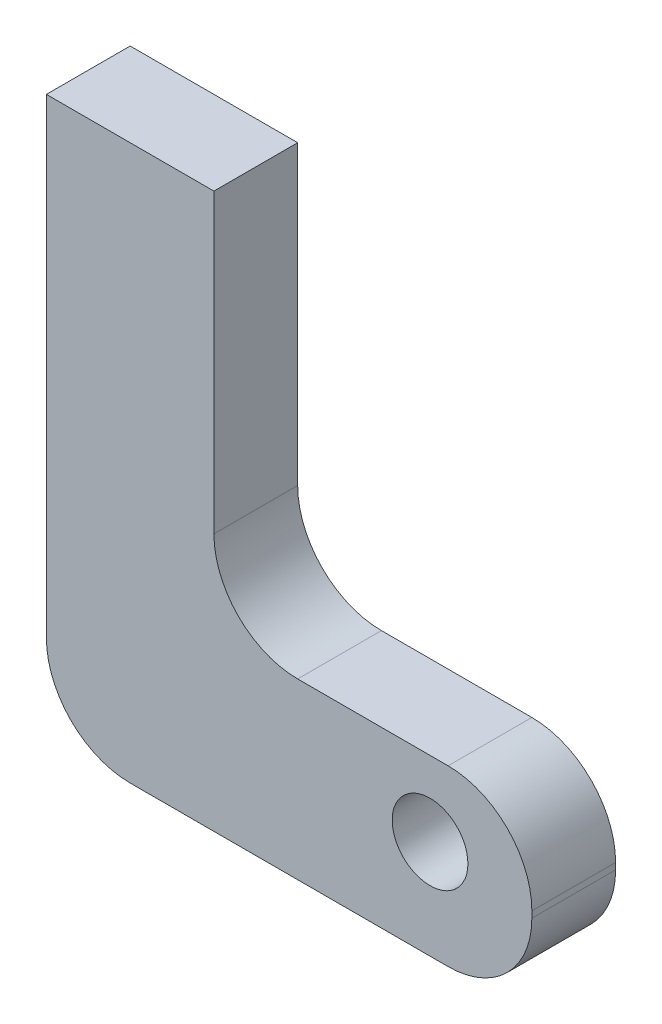
ISO-10303-21;
HEADER;
FILE_DESCRIPTION(('STEP AP214'),'2;1');
FILE_NAME('part.step','',(''),(''),'','','');
FILE_SCHEMA(('AUTOMOTIVE_DESIGN { 1 0 10303 214 1 1 1 1 }'));
ENDSEC;
DATA;
#1=APPLICATION_CONTEXT('core data for automotive mechanical design processes');
#2=APPLICATION_PROTOCOL_DEFINITION('international standard','automotive_design',2000,#1);
#3=PRODUCT_CONTEXT('',#1,'mechanical');
#4=PRODUCT('Part','Part','',(#3));
#5=PRODUCT_RELATED_PRODUCT_CATEGORY('part','',(#4));
#6=PRODUCT_DEFINITION_FORMATION('','',#4);
#7=PRODUCT_DEFINITION_CONTEXT('part definition',#1,'design');
#8=PRODUCT_DEFINITION('design','',#6,#7);
#9=PRODUCT_DEFINITION_SHAPE('','',#8);
#10=(LENGTH_UNIT() NAMED_UNIT(*) SI_UNIT(.MILLI.,.METRE.));
#11=(NAMED_UNIT(*) PLANE_ANGLE_UNIT() SI_UNIT($,.RADIAN.));
#12=(NAMED_UNIT(*) SI_UNIT($,.STERADIAN.) SOLID_ANGLE_UNIT());
#13=UNCERTAINTY_MEASURE_WITH_UNIT(LENGTH_MEASURE(1.E-05),#10,'distance_accuracy_value','');
#14=(GEOMETRIC_REPRESENTATION_CONTEXT(3) GLOBAL_UNCERTAINTY_ASSIGNED_CONTEXT((#13)) GLOBAL_UNIT_ASSIGNED_CONTEXT((#10,
#11,#12)) REPRESENTATION_CONTEXT('',''));
#15=CARTESIAN_POINT('',(0.,0.,0.));
#16=DIRECTION('',(0.,0.,1.));
#17=DIRECTION('',(1.,0.,0.));
#18=AXIS2_PLACEMENT_3D('',#15,#16,#17);
#19=CARTESIAN_POINT('',(0.,0.,6.35));
#20=DIRECTION('',(0.,0.,1.));
#21=DIRECTION('',(1.,0.,0.));
#22=AXIS2_PLACEMENT_3D('',#19,#20,#21);
#23=PLANE('',#22);
#24=DIRECTION('',(0.,-1.,0.));
#25=VECTOR('',#24,1.);
#26=CARTESIAN_POINT('',(113.949884677061,0.,6.35));
#27=LINE('',#26,#25);
#28=CARTESIAN_POINT('',(113.949884677061,0.,6.35));
#29=VERTEX_POINT('',#28);
#30=CARTESIAN_POINT('',(113.949884677061,-35.6901798780592,6.35));
#31=VERTEX_POINT('',#30);
#32=EDGE_CURVE('E151',#29,#31,#27,.T.);
#33=ORIENTED_EDGE('',*,*,#32,.T.);
#34=CARTESIAN_POINT('',(120.299884677061,-35.6901798780592,6.35));
#35=DIRECTION('',(0.,0.,1.));
#36=DIRECTION('',(1.,0.,0.));
#37=AXIS2_PLACEMENT_3D('',#34,#35,#36);
#38=CIRCLE('',#37,6.35);
#39=CARTESIAN_POINT('',(120.299884677061,-42.0401798780592,6.35));
#40=VERTEX_POINT('',#39);
#41=EDGE_CURVE('E169',#31,#40,#38,.T.);
#42=ORIENTED_EDGE('',*,*,#41,.T.);
#43=DIRECTION('',(1.,0.,0.));
#44=VECTOR('',#43,1.);
#45=CARTESIAN_POINT('',(113.949884677061,-42.0401798780592,6.35));
#46=LINE('',#45,#44);
#47=CARTESIAN_POINT('',(144.403776804995,-42.0401798780592,6.35));
#48=VERTEX_POINT('',#47);
#49=EDGE_CURVE('E240',#40,#48,#46,.T.);
#50=ORIENTED_EDGE('',*,*,#49,.T.);
#51=CARTESIAN_POINT('',(144.403776804995,-35.6901798780592,6.35));
#52=DIRECTION('',(0.,0.,1.));
#53=DIRECTION('',(1.,0.,0.));
#54=AXIS2_PLACEMENT_3D('',#51,#52,#53);
#55=CIRCLE('',#54,6.35);
#56=CARTESIAN_POINT('',(150.753776804995,-35.6901798780592,6.35));
#57=VERTEX_POINT('',#56);
#58=EDGE_CURVE('E167',#48,#57,#55,.T.);
#59=ORIENTED_EDGE('',*,*,#58,.T.);
#60=DIRECTION('',(0.,1.,0.));
#61=VECTOR('',#60,1.);
#62=CARTESIAN_POINT('',(150.753776804995,-42.0401798780592,6.35));
#63=LINE('',#62,#61);
#64=CARTESIAN_POINT('',(150.753776804995,-35.205984936289,6.35));
#65=VERTEX_POINT('',#64);
#66=EDGE_CURVE('E237',#57,#65,#63,.T.);
#67=ORIENTED_EDGE('',*,*,#66,.T.);
#68=CARTESIAN_POINT('',(144.403776804995,-35.205984936289,6.35));
#69=DIRECTION('',(0.,0.,1.));
#70=DIRECTION('',(1.,0.,0.));
#71=AXIS2_PLACEMENT_3D('',#68,#69,#70);
#72=CIRCLE('',#71,6.35);
#73=CARTESIAN_POINT('',(144.403776804995,-28.855984936289,6.35));
#74=VERTEX_POINT('',#73);
#75=EDGE_CURVE('E165',#65,#74,#72,.T.);
#76=ORIENTED_EDGE('',*,*,#75,.T.);
#77=DIRECTION('',(-1.,0.,0.));
#78=VECTOR('',#77,1.);
#79=CARTESIAN_POINT('',(126.649884677061,-28.855984936289,6.35));
#80=LINE('',#79,#78);
#81=CARTESIAN_POINT('',(132.999884677061,-28.855984936289,6.35));
#82=VERTEX_POINT('',#81);
#83=EDGE_CURVE('E117',#74,#82,#80,.T.);
#84=ORIENTED_EDGE('',*,*,#83,.T.);
#85=CARTESIAN_POINT('',(132.999884677061,-22.505984936289,6.35));
#86=DIRECTION('',(0.,0.,1.));
#87=DIRECTION('',(1.,0.,0.));
#88=AXIS2_PLACEMENT_3D('',#85,#86,#87);
#89=CIRCLE('',#88,6.35);
#90=CARTESIAN_POINT('',(126.649884677061,-22.505984936289,6.35));
#91=VERTEX_POINT('',#90);
#92=EDGE_CURVE('E11',#82,#91,#89,.F.);
#93=ORIENTED_EDGE('',*,*,#92,.T.);
#94=DIRECTION('',(0.,1.,0.));
#95=VECTOR('',#94,1.);
#96=CARTESIAN_POINT('',(126.649884677061,-6.34999999999994,6.35));
#97=LINE('',#96,#95);
#98=CARTESIAN_POINT('',(126.649884677061,0.,6.35));
#99=VERTEX_POINT('',#98);
#100=EDGE_CURVE('E107',#91,#99,#97,.T.);
#101=ORIENTED_EDGE('',*,*,#100,.T.);
#102=DIRECTION('',(-1.,0.,0.));
#103=VECTOR('',#102,1.);
#104=CARTESIAN_POINT('',(113.949884677061,0.,6.35));
#105=LINE('',#104,#103);
#106=EDGE_CURVE('E112',#99,#29,#105,.T.);
#107=ORIENTED_EDGE('',*,*,#106,.T.);
#108=EDGE_LOOP('',(#33,#42,#50,#59,#67,#76,#84,#93,#101,#107));
#109=FACE_BOUND('',#108,.T.);
#110=CARTESIAN_POINT('',(143.03564126646,-34.5396847170861,6.35));
#111=DIRECTION('',(0.,0.,1.));
#112=DIRECTION('',(1.,0.,0.));
#113=AXIS2_PLACEMENT_3D('',#110,#111,#112);
#114=CIRCLE('',#113,2.87019999999999);
#115=CARTESIAN_POINT('',(145.90584126646,-34.5396847170861,6.35));
#116=VERTEX_POINT('',#115);
#117=EDGE_CURVE('E141',#116,#116,#114,.T.);
#118=ORIENTED_EDGE('',*,*,#117,.F.);
#119=EDGE_LOOP('',(#118));
#120=FACE_BOUND('',#119,.T.);
#121=ADVANCED_FACE('F33',(#109,#120),#23,.T.);
#122=CARTESIAN_POINT('',(0.,0.,0.));
#123=DIRECTION('',(0.,0.,1.));
#124=DIRECTION('',(1.,0.,0.));
#125=AXIS2_PLACEMENT_3D('',#122,#123,#124);
#126=PLANE('',#125);
#127=DIRECTION('',(1.,0.,0.));
#128=VECTOR('',#127,1.);
#129=CARTESIAN_POINT('',(126.649884677061,-42.0401798780592,0.));
#130=LINE('',#129,#128);
#131=CARTESIAN_POINT('',(120.299884677061,-42.0401798780592,0.));
#132=VERTEX_POINT('',#131);
#133=CARTESIAN_POINT('',(144.403776804995,-42.0401798780592,0.));
#134=VERTEX_POINT('',#133);
#135=EDGE_CURVE('E140',#132,#134,#130,.T.);
#136=ORIENTED_EDGE('',*,*,#135,.F.);
#137=CARTESIAN_POINT('',(120.299884677061,-35.6901798780592,0.));
#138=DIRECTION('',(0.,0.,1.));
#139=DIRECTION('',(1.,0.,0.));
#140=AXIS2_PLACEMENT_3D('',#137,#138,#139);
#141=CIRCLE('',#140,6.35);
#142=CARTESIAN_POINT('',(113.949884677061,-35.6901798780592,0.));
#143=VERTEX_POINT('',#142);
#144=EDGE_CURVE('E161',#132,#143,#141,.F.);
#145=ORIENTED_EDGE('',*,*,#144,.T.);
#146=DIRECTION('',(0.,-1.,0.));
#147=VECTOR('',#146,1.);
#148=CARTESIAN_POINT('',(113.949884677061,-6.34999999999994,0.));
#149=LINE('',#148,#147);
#150=CARTESIAN_POINT('',(113.949884677061,0.,0.));
#151=VERTEX_POINT('',#150);
#152=EDGE_CURVE('E137',#151,#143,#149,.T.);
#153=ORIENTED_EDGE('',*,*,#152,.F.);
#154=DIRECTION('',(-1.,0.,0.));
#155=VECTOR('',#154,1.);
#156=CARTESIAN_POINT('',(113.949884677061,0.,0.));
#157=LINE('',#156,#155);
#158=CARTESIAN_POINT('',(126.649884677061,0.,0.));
#159=VERTEX_POINT('',#158);
#160=EDGE_CURVE('E150',#159,#151,#157,.T.);
#161=ORIENTED_EDGE('',*,*,#160,.F.);
#162=DIRECTION('',(0.,1.,0.));
#163=VECTOR('',#162,1.);
#164=CARTESIAN_POINT('',(126.649884677061,0.,0.));
#165=LINE('',#164,#163);
#166=CARTESIAN_POINT('',(126.649884677061,-22.505984936289,0.));
#167=VERTEX_POINT('',#166);
#168=EDGE_CURVE('E123',#167,#159,#165,.T.);
#169=ORIENTED_EDGE('',*,*,#168,.F.);
#170=CARTESIAN_POINT('',(132.999884677061,-22.505984936289,0.));
#171=DIRECTION('',(0.,0.,1.));
#172=DIRECTION('',(1.,0.,0.));
#173=AXIS2_PLACEMENT_3D('',#170,#171,#172);
#174=CIRCLE('',#173,6.35);
#175=CARTESIAN_POINT('',(132.999884677061,-28.855984936289,0.));
#176=VERTEX_POINT('',#175);
#177=EDGE_CURVE('E41',#167,#176,#174,.T.);
#178=ORIENTED_EDGE('',*,*,#177,.T.);
#179=DIRECTION('',(-1.,0.,0.));
#180=VECTOR('',#179,1.);
#181=CARTESIAN_POINT('',(126.649884677061,-28.855984936289,0.));
#182=LINE('',#181,#180);
#183=CARTESIAN_POINT('',(144.403776804995,-28.855984936289,0.));
#184=VERTEX_POINT('',#183);
#185=EDGE_CURVE('E147',#184,#176,#182,.T.);
#186=ORIENTED_EDGE('',*,*,#185,.F.);
#187=CARTESIAN_POINT('',(144.403776804995,-35.205984936289,0.));
#188=DIRECTION('',(0.,0.,1.));
#189=DIRECTION('',(1.,0.,0.));
#190=AXIS2_PLACEMENT_3D('',#187,#188,#189);
#191=CIRCLE('',#190,6.35);
#192=CARTESIAN_POINT('',(150.753776804995,-35.205984936289,0.));
#193=VERTEX_POINT('',#192);
#194=EDGE_CURVE('E157',#184,#193,#191,.F.);
#195=ORIENTED_EDGE('',*,*,#194,.T.);
#196=DIRECTION('',(0.,1.,0.));
#197=VECTOR('',#196,1.);
#198=CARTESIAN_POINT('',(150.753776804995,-42.0401798780592,0.));
#199=LINE('',#198,#197);
#200=CARTESIAN_POINT('',(150.753776804995,-35.6901798780592,0.));
#201=VERTEX_POINT('',#200);
#202=EDGE_CURVE('E144',#201,#193,#199,.T.);
#203=ORIENTED_EDGE('',*,*,#202,.F.);
#204=CARTESIAN_POINT('',(144.403776804995,-35.6901798780592,0.));
#205=DIRECTION('',(0.,0.,1.));
#206=DIRECTION('',(1.,0.,0.));
#207=AXIS2_PLACEMENT_3D('',#204,#205,#206);
#208=CIRCLE('',#207,6.35);
#209=EDGE_CURVE('E159',#201,#134,#208,.F.);
#210=ORIENTED_EDGE('',*,*,#209,.T.);
#211=EDGE_LOOP('',(#136,#145,#153,#161,#169,#178,#186,#195,#203,#210));
#212=FACE_BOUND('',#211,.T.);
#213=CARTESIAN_POINT('',(143.03564126646,-34.5396847170861,0.));
#214=DIRECTION('',(0.,0.,1.));
#215=DIRECTION('',(1.,0.,0.));
#216=AXIS2_PLACEMENT_3D('',#213,#214,#215);
#217=CIRCLE('',#216,2.87019999999999);
#218=CARTESIAN_POINT('',(145.90584126646,-34.5396847170861,0.));
#219=VERTEX_POINT('',#218);
#220=EDGE_CURVE('E247',#219,#219,#217,.T.);
#221=ORIENTED_EDGE('',*,*,#220,.T.);
#222=EDGE_LOOP('',(#221));
#223=FACE_BOUND('',#222,.T.);
#224=ADVANCED_FACE('F184',(#212,#223),#126,.F.);
#225=CARTESIAN_POINT('',(113.949884677061,-6.34999999999994,6.35));
#226=DIRECTION('',(1.,0.,0.));
#227=DIRECTION('',(0.,0.,-1.));
#228=AXIS2_PLACEMENT_3D('',#225,#226,#227);
#229=PLANE('',#228);
#230=ORIENTED_EDGE('',*,*,#152,.T.);
#231=DIRECTION('',(0.,0.,-1.));
#232=VECTOR('',#231,1.);
#233=CARTESIAN_POINT('',(113.949884677061,-35.6901798780592,6.35));
#234=LINE('',#233,#232);
#235=EDGE_CURVE('E163',#143,#31,#234,.F.);
#236=ORIENTED_EDGE('',*,*,#235,.T.);
#237=ORIENTED_EDGE('',*,*,#32,.F.);
#238=DIRECTION('',(0.,0.,-1.));
#239=VECTOR('',#238,1.);
#240=CARTESIAN_POINT('',(113.949884677061,0.,6.35));
#241=LINE('',#240,#239);
#242=EDGE_CURVE('E128',#29,#151,#241,.T.);
#243=ORIENTED_EDGE('',*,*,#242,.T.);
#244=EDGE_LOOP('',(#230,#236,#237,#243));
#245=FACE_BOUND('',#244,.T.);
#246=ADVANCED_FACE('F201',(#245),#229,.F.);
#247=CARTESIAN_POINT('',(126.649884677061,-42.0401798780592,6.35));
#248=DIRECTION('',(0.,1.,0.));
#249=DIRECTION('',(0.,0.,1.));
#250=AXIS2_PLACEMENT_3D('',#247,#248,#249);
#251=PLANE('',#250);
#252=ORIENTED_EDGE('',*,*,#49,.F.);
#253=DIRECTION('',(0.,0.,-1.));
#254=VECTOR('',#253,1.);
#255=CARTESIAN_POINT('',(120.299884677061,-42.0401798780592,6.35));
#256=LINE('',#255,#254);
#257=EDGE_CURVE('E154',#40,#132,#256,.T.);
#258=ORIENTED_EDGE('',*,*,#257,.T.);
#259=ORIENTED_EDGE('',*,*,#135,.T.);
#260=DIRECTION('',(0.,0.,-1.));
#261=VECTOR('',#260,1.);
#262=CARTESIAN_POINT('',(144.403776804995,-42.0401798780592,6.35));
#263=LINE('',#262,#261);
#264=EDGE_CURVE('E127',#134,#48,#263,.F.);
#265=ORIENTED_EDGE('',*,*,#264,.T.);
#266=EDGE_LOOP('',(#252,#258,#259,#265));
#267=FACE_BOUND('',#266,.T.);
#268=ADVANCED_FACE('F215',(#267),#251,.F.);
#269=CARTESIAN_POINT('',(150.753776804995,-42.0401798780592,6.35));
#270=DIRECTION('',(-1.,0.,0.));
#271=DIRECTION('',(0.,0.,1.));
#272=AXIS2_PLACEMENT_3D('',#269,#270,#271);
#273=PLANE('',#272);
#274=ORIENTED_EDGE('',*,*,#66,.F.);
#275=DIRECTION('',(0.,0.,-1.));
#276=VECTOR('',#275,1.);
#277=CARTESIAN_POINT('',(150.753776804995,-35.6901798780592,6.35));
#278=LINE('',#277,#276);
#279=EDGE_CURVE('E173',#57,#201,#278,.T.);
#280=ORIENTED_EDGE('',*,*,#279,.T.);
#281=ORIENTED_EDGE('',*,*,#202,.T.);
#282=DIRECTION('',(0.,0.,-1.));
#283=VECTOR('',#282,1.);
#284=CARTESIAN_POINT('',(150.753776804995,-35.205984936289,6.35));
#285=LINE('',#284,#283);
#286=EDGE_CURVE('E171',#193,#65,#285,.F.);
#287=ORIENTED_EDGE('',*,*,#286,.T.);
#288=EDGE_LOOP('',(#274,#280,#281,#287));
#289=FACE_BOUND('',#288,.T.);
#290=ADVANCED_FACE('F212',(#289),#273,.F.);
#291=CARTESIAN_POINT('',(126.649884677061,-28.855984936289,6.35));
#292=DIRECTION('',(0.,-1.,0.));
#293=DIRECTION('',(0.,0.,-1.));
#294=AXIS2_PLACEMENT_3D('',#291,#292,#293);
#295=PLANE('',#294);
#296=ORIENTED_EDGE('',*,*,#83,.F.);
#297=DIRECTION('',(0.,0.,-1.));
#298=VECTOR('',#297,1.);
#299=CARTESIAN_POINT('',(144.403776804995,-28.855984936289,6.35));
#300=LINE('',#299,#298);
#301=EDGE_CURVE('E177',#74,#184,#300,.T.);
#302=ORIENTED_EDGE('',*,*,#301,.T.);
#303=ORIENTED_EDGE('',*,*,#185,.T.);
#304=DIRECTION('',(0.,0.,-1.));
#305=VECTOR('',#304,1.);
#306=CARTESIAN_POINT('',(132.999884677061,-28.855984936289,6.35));
#307=LINE('',#306,#305);
#308=EDGE_CURVE('E54',#176,#82,#307,.F.);
#309=ORIENTED_EDGE('',*,*,#308,.T.);
#310=EDGE_LOOP('',(#296,#302,#303,#309));
#311=FACE_BOUND('',#310,.T.);
#312=ADVANCED_FACE('F187',(#311),#295,.F.);
#313=CARTESIAN_POINT('',(126.649884677061,0.,6.35));
#314=DIRECTION('',(-1.,0.,0.));
#315=DIRECTION('',(0.,0.,1.));
#316=AXIS2_PLACEMENT_3D('',#313,#314,#315);
#317=PLANE('',#316);
#318=ORIENTED_EDGE('',*,*,#100,.F.);
#319=DIRECTION('',(0.,0.,-1.));
#320=VECTOR('',#319,1.);
#321=CARTESIAN_POINT('',(126.649884677061,-22.505984936289,0.));
#322=LINE('',#321,#320);
#323=EDGE_CURVE('E180',#91,#167,#322,.T.);
#324=ORIENTED_EDGE('',*,*,#323,.T.);
#325=ORIENTED_EDGE('',*,*,#168,.T.);
#326=DIRECTION('',(0.,0.,-1.));
#327=VECTOR('',#326,1.);
#328=CARTESIAN_POINT('',(126.649884677061,0.,6.35));
#329=LINE('',#328,#327);
#330=EDGE_CURVE('E120',#99,#159,#329,.T.);
#331=ORIENTED_EDGE('',*,*,#330,.F.);
#332=EDGE_LOOP('',(#318,#324,#325,#331));
#333=FACE_BOUND('',#332,.T.);
#334=ADVANCED_FACE('F121',(#333),#317,.F.);
#335=CARTESIAN_POINT('',(113.949884677061,0.,6.35));
#336=DIRECTION('',(0.,-1.,0.));
#337=DIRECTION('',(0.,0.,-1.));
#338=AXIS2_PLACEMENT_3D('',#335,#336,#337);
#339=PLANE('',#338);
#340=ORIENTED_EDGE('',*,*,#160,.T.);
#341=ORIENTED_EDGE('',*,*,#242,.F.);
#342=ORIENTED_EDGE('',*,*,#106,.F.);
#343=ORIENTED_EDGE('',*,*,#330,.T.);
#344=EDGE_LOOP('',(#340,#341,#342,#343));
#345=FACE_BOUND('',#344,.T.);
#346=ADVANCED_FACE('F130',(#345),#339,.F.);
#347=CARTESIAN_POINT('',(143.03564126646,-34.5396847170861,6.35));
#348=DIRECTION('',(0.,0.,-1.));
#349=DIRECTION('',(-1.,0.,0.));
#350=AXIS2_PLACEMENT_3D('',#347,#348,#349);
#351=CYLINDRICAL_SURFACE('',#350,2.87019999999999);
#352=ORIENTED_EDGE('',*,*,#117,.T.);
#353=EDGE_LOOP('',(#352));
#354=FACE_BOUND('',#353,.T.);
#355=ORIENTED_EDGE('',*,*,#220,.F.);
#356=EDGE_LOOP('',(#355));
#357=FACE_BOUND('',#356,.T.);
#358=ADVANCED_FACE('F204',(#354,#357),#351,.F.);
#359=CARTESIAN_POINT('',(120.299884677061,-35.6901798780592,6.35));
#360=DIRECTION('',(0.,0.,-1.));
#361=DIRECTION('',(-1.,0.,0.));
#362=AXIS2_PLACEMENT_3D('',#359,#360,#361);
#363=CYLINDRICAL_SURFACE('',#362,6.35);
#364=ORIENTED_EDGE('',*,*,#41,.F.);
#365=ORIENTED_EDGE('',*,*,#235,.F.);
#366=ORIENTED_EDGE('',*,*,#144,.F.);
#367=ORIENTED_EDGE('',*,*,#257,.F.);
#368=EDGE_LOOP('',(#364,#365,#366,#367));
#369=FACE_BOUND('',#368,.T.);
#370=ADVANCED_FACE('F223',(#369),#363,.T.);
#371=CARTESIAN_POINT('',(144.403776804995,-35.6901798780592,6.35));
#372=DIRECTION('',(0.,0.,-1.));
#373=DIRECTION('',(-1.,0.,0.));
#374=AXIS2_PLACEMENT_3D('',#371,#372,#373);
#375=CYLINDRICAL_SURFACE('',#374,6.35);
#376=ORIENTED_EDGE('',*,*,#58,.F.);
#377=ORIENTED_EDGE('',*,*,#264,.F.);
#378=ORIENTED_EDGE('',*,*,#209,.F.);
#379=ORIENTED_EDGE('',*,*,#279,.F.);
#380=EDGE_LOOP('',(#376,#377,#378,#379));
#381=FACE_BOUND('',#380,.T.);
#382=ADVANCED_FACE('F194',(#381),#375,.T.);
#383=CARTESIAN_POINT('',(144.403776804995,-35.205984936289,6.35));
#384=DIRECTION('',(0.,0.,-1.));
#385=DIRECTION('',(-1.,0.,0.));
#386=AXIS2_PLACEMENT_3D('',#383,#384,#385);
#387=CYLINDRICAL_SURFACE('',#386,6.35);
#388=ORIENTED_EDGE('',*,*,#75,.F.);
#389=ORIENTED_EDGE('',*,*,#286,.F.);
#390=ORIENTED_EDGE('',*,*,#194,.F.);
#391=ORIENTED_EDGE('',*,*,#301,.F.);
#392=EDGE_LOOP('',(#388,#389,#390,#391));
#393=FACE_BOUND('',#392,.T.);
#394=ADVANCED_FACE('F190',(#393),#387,.T.);
#395=CARTESIAN_POINT('',(132.999884677061,-22.505984936289,6.35));
#396=DIRECTION('',(0.,0.,1.));
#397=DIRECTION('',(1.,0.,0.));
#398=AXIS2_PLACEMENT_3D('',#395,#396,#397);
#399=CYLINDRICAL_SURFACE('',#398,6.35);
#400=ORIENTED_EDGE('',*,*,#92,.F.);
#401=ORIENTED_EDGE('',*,*,#308,.F.);
#402=ORIENTED_EDGE('',*,*,#177,.F.);
#403=ORIENTED_EDGE('',*,*,#323,.F.);
#404=EDGE_LOOP('',(#400,#401,#402,#403));
#405=FACE_BOUND('',#404,.T.);
#406=ADVANCED_FACE('F35',(#405),#399,.F.);
#407=CLOSED_SHELL('',(#121,#224,#246,#268,#290,#312,#334,#346,#358,#370,#382,#394,#406));
#408=MANIFOLD_SOLID_BREP('B2',#407);
#409=ADVANCED_BREP_SHAPE_REPRESENTATION('',(#18,#408),#14);
#410=SHAPE_DEFINITION_REPRESENTATION(#9,#409);
ENDSEC;
END-ISO-10303-21;
